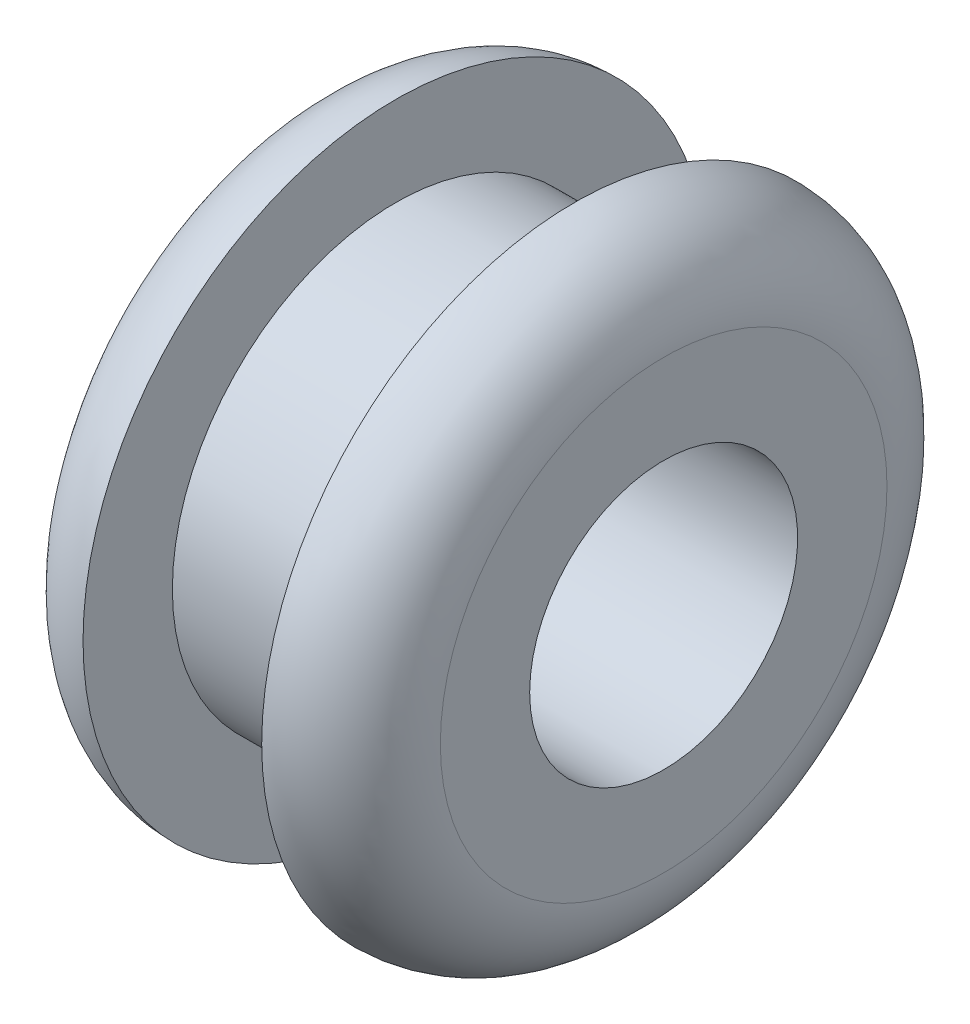
ISO-10303-21;
HEADER;
FILE_DESCRIPTION(('STEP AP214'),'2;1');
FILE_NAME('part.step','',(''),(''),'','','');
FILE_SCHEMA(('AUTOMOTIVE_DESIGN { 1 0 10303 214 1 1 1 1 }'));
ENDSEC;
DATA;
#1=APPLICATION_CONTEXT('core data for automotive mechanical design processes');
#2=APPLICATION_PROTOCOL_DEFINITION('international standard','automotive_design',2000,#1);
#3=PRODUCT_CONTEXT('',#1,'mechanical');
#4=PRODUCT('Part','Part','',(#3));
#5=PRODUCT_RELATED_PRODUCT_CATEGORY('part','',(#4));
#6=PRODUCT_DEFINITION_FORMATION('','',#4);
#7=PRODUCT_DEFINITION_CONTEXT('part definition',#1,'design');
#8=PRODUCT_DEFINITION('design','',#6,#7);
#9=PRODUCT_DEFINITION_SHAPE('','',#8);
#10=(LENGTH_UNIT() NAMED_UNIT(*) SI_UNIT(.MILLI.,.METRE.));
#11=(NAMED_UNIT(*) PLANE_ANGLE_UNIT() SI_UNIT($,.RADIAN.));
#12=(NAMED_UNIT(*) SI_UNIT($,.STERADIAN.) SOLID_ANGLE_UNIT());
#13=UNCERTAINTY_MEASURE_WITH_UNIT(LENGTH_MEASURE(1.E-05),#10,'distance_accuracy_value','');
#14=(GEOMETRIC_REPRESENTATION_CONTEXT(3) GLOBAL_UNCERTAINTY_ASSIGNED_CONTEXT((#13)) GLOBAL_UNIT_ASSIGNED_CONTEXT((#10,
#11,#12)) REPRESENTATION_CONTEXT('',''));
#15=CARTESIAN_POINT('',(0.,0.,0.));
#16=DIRECTION('',(0.,0.,1.));
#17=DIRECTION('',(1.,0.,0.));
#18=AXIS2_PLACEMENT_3D('',#15,#16,#17);
#19=CARTESIAN_POINT('',(3.175,2.38125,0.));
#20=DIRECTION('',(-1.,0.,0.));
#21=DIRECTION('',(0.,0.,1.));
#22=AXIS2_PLACEMENT_3D('',#19,#20,#21);
#23=PLANE('',#22);
#24=CARTESIAN_POINT('',(3.175,0.,0.));
#25=DIRECTION('',(-1.,0.,0.));
#26=DIRECTION('',(0.,0.,1.));
#27=AXIS2_PLACEMENT_3D('',#24,#25,#26);
#28=CIRCLE('',#27,3.96875);
#29=CARTESIAN_POINT('',(3.175,0.,3.96875));
#30=VERTEX_POINT('',#29);
#31=EDGE_CURVE('E10',#30,#30,#28,.T.);
#32=ORIENTED_EDGE('',*,*,#31,.F.);
#33=EDGE_LOOP('',(#32));
#34=FACE_BOUND('',#33,.T.);
#35=CARTESIAN_POINT('',(3.175,0.,0.));
#36=DIRECTION('',(-1.,0.,0.));
#37=DIRECTION('',(0.,0.,1.));
#38=AXIS2_PLACEMENT_3D('',#35,#36,#37);
#39=CIRCLE('',#38,2.38125);
#40=CARTESIAN_POINT('',(3.175,0.,2.38125));
#41=VERTEX_POINT('',#40);
#42=EDGE_CURVE('E62',#41,#41,#39,.T.);
#43=ORIENTED_EDGE('',*,*,#42,.T.);
#44=EDGE_LOOP('',(#43));
#45=FACE_BOUND('',#44,.T.);
#46=ADVANCED_FACE('F34',(#34,#45),#23,.F.);
#47=CARTESIAN_POINT('',(1.5875,0.,0.));
#48=DIRECTION('',(-1.,0.,0.));
#49=DIRECTION('',(0.,0.,1.));
#50=AXIS2_PLACEMENT_3D('',#47,#48,#49);
#51=TOROIDAL_SURFACE('',#50,3.96875,1.5875);
#52=CARTESIAN_POINT('',(1.5875,0.,0.));
#53=DIRECTION('',(-1.,0.,0.));
#54=DIRECTION('',(0.,0.,1.));
#55=AXIS2_PLACEMENT_3D('',#52,#53,#54);
#56=CIRCLE('',#55,5.55625);
#57=CARTESIAN_POINT('',(1.5875,0.,5.55625));
#58=VERTEX_POINT('',#57);
#59=EDGE_CURVE('E40',#58,#58,#56,.T.);
#60=ORIENTED_EDGE('',*,*,#59,.F.);
#61=EDGE_LOOP('',(#60));
#62=FACE_BOUND('',#61,.T.);
#63=ORIENTED_EDGE('',*,*,#31,.T.);
#64=EDGE_LOOP('',(#63));
#65=FACE_BOUND('',#64,.T.);
#66=ADVANCED_FACE('F99',(#62,#65),#51,.T.);
#67=CARTESIAN_POINT('',(1.5875,5.55625,0.));
#68=DIRECTION('',(1.,0.,0.));
#69=DIRECTION('',(0.,0.,-1.));
#70=AXIS2_PLACEMENT_3D('',#67,#68,#69);
#71=PLANE('',#70);
#72=CARTESIAN_POINT('',(1.5875,0.,0.));
#73=DIRECTION('',(-1.,0.,0.));
#74=DIRECTION('',(0.,0.,1.));
#75=AXIS2_PLACEMENT_3D('',#72,#73,#74);
#76=CIRCLE('',#75,3.96875);
#77=CARTESIAN_POINT('',(1.5875,0.,3.96875));
#78=VERTEX_POINT('',#77);
#79=EDGE_CURVE('E44',#78,#78,#76,.T.);
#80=ORIENTED_EDGE('',*,*,#79,.F.);
#81=EDGE_LOOP('',(#80));
#82=FACE_BOUND('',#81,.T.);
#83=ORIENTED_EDGE('',*,*,#59,.T.);
#84=EDGE_LOOP('',(#83));
#85=FACE_BOUND('',#84,.T.);
#86=ADVANCED_FACE('F94',(#82,#85),#71,.F.);
#87=CARTESIAN_POINT('',(-4.91167873474644,0.,0.));
#88=DIRECTION('',(-1.,0.,0.));
#89=DIRECTION('',(0.,0.,1.));
#90=AXIS2_PLACEMENT_3D('',#87,#88,#89);
#91=CYLINDRICAL_SURFACE('',#90,3.96875);
#92=CARTESIAN_POINT('',(-1.5875,0.,0.));
#93=DIRECTION('',(-1.,0.,0.));
#94=DIRECTION('',(0.,0.,1.));
#95=AXIS2_PLACEMENT_3D('',#92,#93,#94);
#96=CIRCLE('',#95,3.96875);
#97=CARTESIAN_POINT('',(-1.5875,0.,3.96875));
#98=VERTEX_POINT('',#97);
#99=EDGE_CURVE('E48',#98,#98,#96,.T.);
#100=ORIENTED_EDGE('',*,*,#99,.F.);
#101=EDGE_LOOP('',(#100));
#102=FACE_BOUND('',#101,.T.);
#103=ORIENTED_EDGE('',*,*,#79,.T.);
#104=EDGE_LOOP('',(#103));
#105=FACE_BOUND('',#104,.T.);
#106=ADVANCED_FACE('F88',(#102,#105),#91,.T.);
#107=CARTESIAN_POINT('',(-1.5875,5.55625,0.));
#108=DIRECTION('',(-1.,0.,0.));
#109=DIRECTION('',(0.,0.,1.));
#110=AXIS2_PLACEMENT_3D('',#107,#108,#109);
#111=PLANE('',#110);
#112=CARTESIAN_POINT('',(-1.5875,0.,0.));
#113=DIRECTION('',(-1.,0.,0.));
#114=DIRECTION('',(0.,0.,1.));
#115=AXIS2_PLACEMENT_3D('',#112,#113,#114);
#116=CIRCLE('',#115,5.55625);
#117=CARTESIAN_POINT('',(-1.5875,0.,5.55625));
#118=VERTEX_POINT('',#117);
#119=EDGE_CURVE('E53',#118,#118,#116,.T.);
#120=ORIENTED_EDGE('',*,*,#119,.F.);
#121=EDGE_LOOP('',(#120));
#122=FACE_BOUND('',#121,.T.);
#123=ORIENTED_EDGE('',*,*,#99,.T.);
#124=EDGE_LOOP('',(#123));
#125=FACE_BOUND('',#124,.T.);
#126=ADVANCED_FACE('F82',(#122,#125),#111,.F.);
#127=CARTESIAN_POINT('',(-1.5875,0.,0.));
#128=DIRECTION('',(-1.,0.,0.));
#129=DIRECTION('',(0.,0.,1.));
#130=AXIS2_PLACEMENT_3D('',#127,#128,#129);
#131=TOROIDAL_SURFACE('',#130,3.96875,1.5875);
#132=CARTESIAN_POINT('',(-3.175,0.,0.));
#133=DIRECTION('',(-1.,0.,0.));
#134=DIRECTION('',(0.,0.,1.));
#135=AXIS2_PLACEMENT_3D('',#132,#133,#134);
#136=CIRCLE('',#135,3.96875);
#137=CARTESIAN_POINT('',(-3.175,0.,3.96875));
#138=VERTEX_POINT('',#137);
#139=EDGE_CURVE('E56',#138,#138,#136,.T.);
#140=ORIENTED_EDGE('',*,*,#139,.F.);
#141=EDGE_LOOP('',(#140));
#142=FACE_BOUND('',#141,.T.);
#143=ORIENTED_EDGE('',*,*,#119,.T.);
#144=EDGE_LOOP('',(#143));
#145=FACE_BOUND('',#144,.T.);
#146=ADVANCED_FACE('F76',(#142,#145),#131,.T.);
#147=CARTESIAN_POINT('',(-3.175,2.38125,0.));
#148=DIRECTION('',(1.,0.,0.));
#149=DIRECTION('',(0.,0.,-1.));
#150=AXIS2_PLACEMENT_3D('',#147,#148,#149);
#151=PLANE('',#150);
#152=CARTESIAN_POINT('',(-3.175,0.,0.));
#153=DIRECTION('',(-1.,0.,0.));
#154=DIRECTION('',(0.,0.,1.));
#155=AXIS2_PLACEMENT_3D('',#152,#153,#154);
#156=CIRCLE('',#155,2.38125);
#157=CARTESIAN_POINT('',(-3.175,0.,2.38125));
#158=VERTEX_POINT('',#157);
#159=EDGE_CURVE('E59',#158,#158,#156,.T.);
#160=ORIENTED_EDGE('',*,*,#159,.F.);
#161=EDGE_LOOP('',(#160));
#162=FACE_BOUND('',#161,.T.);
#163=ORIENTED_EDGE('',*,*,#139,.T.);
#164=EDGE_LOOP('',(#163));
#165=FACE_BOUND('',#164,.T.);
#166=ADVANCED_FACE('F70',(#162,#165),#151,.F.);
#167=CARTESIAN_POINT('',(-4.91167873474644,0.,0.));
#168=DIRECTION('',(-1.,0.,0.));
#169=DIRECTION('',(0.,0.,1.));
#170=AXIS2_PLACEMENT_3D('',#167,#168,#169);
#171=CYLINDRICAL_SURFACE('',#170,2.38125);
#172=ORIENTED_EDGE('',*,*,#42,.F.);
#173=EDGE_LOOP('',(#172));
#174=FACE_BOUND('',#173,.T.);
#175=ORIENTED_EDGE('',*,*,#159,.T.);
#176=EDGE_LOOP('',(#175));
#177=FACE_BOUND('',#176,.T.);
#178=ADVANCED_FACE('F67',(#174,#177),#171,.F.);
#179=CLOSED_SHELL('',(#46,#66,#86,#106,#126,#146,#166,#178));
#180=MANIFOLD_SOLID_BREP('B2',#179);
#181=ADVANCED_BREP_SHAPE_REPRESENTATION('',(#18,#180),#14);
#182=SHAPE_DEFINITION_REPRESENTATION(#9,#181);
ENDSEC;
END-ISO-10303-21;
